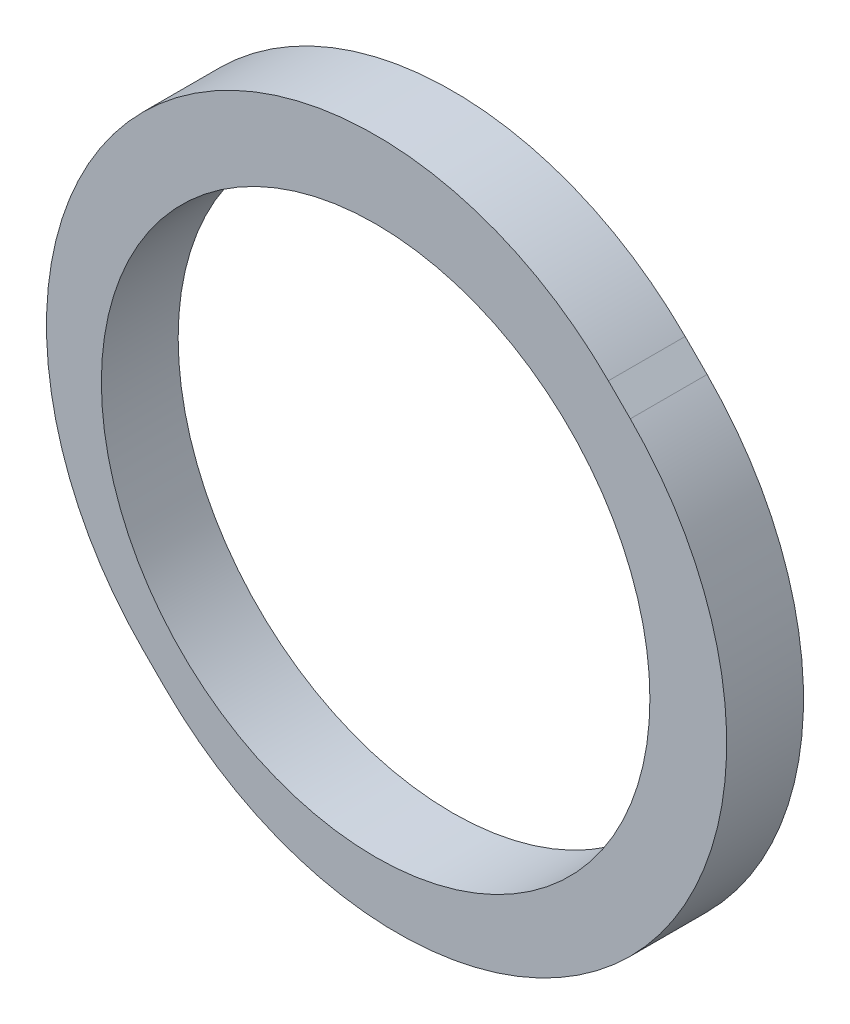
ISO-10303-21;
HEADER;
FILE_DESCRIPTION(('STEP AP214'),'2;1');
FILE_NAME('part.step','',(''),(''),'','','');
FILE_SCHEMA(('AUTOMOTIVE_DESIGN { 1 0 10303 214 1 1 1 1 }'));
ENDSEC;
DATA;
#1=APPLICATION_CONTEXT('core data for automotive mechanical design processes');
#2=APPLICATION_PROTOCOL_DEFINITION('international standard','automotive_design',2000,#1);
#3=PRODUCT_CONTEXT('',#1,'mechanical');
#4=PRODUCT('Part','Part','',(#3));
#5=PRODUCT_RELATED_PRODUCT_CATEGORY('part','',(#4));
#6=PRODUCT_DEFINITION_FORMATION('','',#4);
#7=PRODUCT_DEFINITION_CONTEXT('part definition',#1,'design');
#8=PRODUCT_DEFINITION('design','',#6,#7);
#9=PRODUCT_DEFINITION_SHAPE('','',#8);
#10=(LENGTH_UNIT() NAMED_UNIT(*) SI_UNIT(.MILLI.,.METRE.));
#11=(NAMED_UNIT(*) PLANE_ANGLE_UNIT() SI_UNIT($,.RADIAN.));
#12=(NAMED_UNIT(*) SI_UNIT($,.STERADIAN.) SOLID_ANGLE_UNIT());
#13=UNCERTAINTY_MEASURE_WITH_UNIT(LENGTH_MEASURE(1.E-05),#10,'distance_accuracy_value','');
#14=(GEOMETRIC_REPRESENTATION_CONTEXT(3) GLOBAL_UNCERTAINTY_ASSIGNED_CONTEXT((#13)) GLOBAL_UNIT_ASSIGNED_CONTEXT((#10,
#11,#12)) REPRESENTATION_CONTEXT('',''));
#15=CARTESIAN_POINT('',(0.,0.,0.));
#16=DIRECTION('',(0.,0.,1.));
#17=DIRECTION('',(1.,0.,0.));
#18=AXIS2_PLACEMENT_3D('',#15,#16,#17);
#19=CARTESIAN_POINT('',(98.07,-118.29,-0.045));
#20=DIRECTION('',(0.,0.,-1.));
#21=DIRECTION('',(0.,-1.,0.));
#22=AXIS2_PLACEMENT_3D('',#19,#20,#21);
#23=CYLINDRICAL_SURFACE('',#22,0.125);
#24=CARTESIAN_POINT('',(98.07,-118.29,1.6));
#25=DIRECTION('',(0.,0.,-1.));
#26=DIRECTION('',(0.,-1.,0.));
#27=AXIS2_PLACEMENT_3D('',#24,#25,#26);
#28=CIRCLE('',#27,0.125);
#29=CARTESIAN_POINT('',(98.07,-118.415,1.6));
#30=VERTEX_POINT('',#29);
#31=EDGE_CURVE('E112',#30,#30,#28,.T.);
#32=ORIENTED_EDGE('',*,*,#31,.T.);
#33=DIRECTION('',(0.,0.,1.));
#34=VECTOR('',#33,1.);
#35=CARTESIAN_POINT('',(98.07,-118.415,-0.045));
#36=LINE('',#35,#34);
#37=CARTESIAN_POINT('',(98.07,-118.415,1.635));
#38=VERTEX_POINT('',#37);
#39=EDGE_CURVE('E11',#30,#38,#36,.T.);
#40=ORIENTED_EDGE('',*,*,#39,.T.);
#41=CARTESIAN_POINT('',(98.07,-118.29,1.635));
#42=DIRECTION('',(0.,0.,-1.));
#43=DIRECTION('',(0.,-1.,0.));
#44=AXIS2_PLACEMENT_3D('',#41,#42,#43);
#45=CIRCLE('',#44,0.125);
#46=EDGE_CURVE('E26',#38,#38,#45,.T.);
#47=ORIENTED_EDGE('',*,*,#46,.F.);
#48=ORIENTED_EDGE('',*,*,#39,.F.);
#49=EDGE_LOOP('',(#32,#40,#47,#48));
#50=FACE_BOUND('',#49,.T.);
#51=ADVANCED_FACE('F17',(#50),#23,.F.);
#52=CARTESIAN_POINT('',(98.186066,-118.183933,1.6));
#53=DIRECTION('',(-0.707106781186548,-0.707106781186548,0.));
#54=DIRECTION('',(-0.707106781186548,0.707106781186548,0.));
#55=AXIS2_PLACEMENT_3D('',#52,#53,#54);
#56=PLANE('',#55);
#57=DIRECTION('',(-0.707106781186548,0.707106781186548,0.));
#58=VECTOR('',#57,1.);
#59=CARTESIAN_POINT('',(98.186066,-118.183933,1.6));
#60=LINE('',#59,#58);
#61=CARTESIAN_POINT('',(98.186066,-118.183933,1.6));
#62=VERTEX_POINT('',#61);
#63=CARTESIAN_POINT('',(98.176066,-118.173933,1.6));
#64=VERTEX_POINT('',#63);
#65=EDGE_CURVE('E116',#62,#64,#60,.T.);
#66=ORIENTED_EDGE('',*,*,#65,.T.);
#67=DIRECTION('',(0.,0.,1.));
#68=VECTOR('',#67,1.);
#69=CARTESIAN_POINT('',(98.176066,-118.173933,1.6));
#70=LINE('',#69,#68);
#71=CARTESIAN_POINT('',(98.176066,-118.173933,1.635));
#72=VERTEX_POINT('',#71);
#73=EDGE_CURVE('E84',#64,#72,#70,.T.);
#74=ORIENTED_EDGE('',*,*,#73,.T.);
#75=DIRECTION('',(-0.707106781186548,0.707106781186548,0.));
#76=VECTOR('',#75,1.);
#77=CARTESIAN_POINT('',(98.186066,-118.183933,1.635));
#78=LINE('',#77,#76);
#79=CARTESIAN_POINT('',(98.186066,-118.183933,1.635));
#80=VERTEX_POINT('',#79);
#81=EDGE_CURVE('E129',#80,#72,#78,.T.);
#82=ORIENTED_EDGE('',*,*,#81,.F.);
#83=DIRECTION('',(0.,0.,1.));
#84=VECTOR('',#83,1.);
#85=CARTESIAN_POINT('',(98.186066,-118.183933,1.6));
#86=LINE('',#85,#84);
#87=EDGE_CURVE('E126',#62,#80,#86,.T.);
#88=ORIENTED_EDGE('',*,*,#87,.F.);
#89=EDGE_LOOP('',(#66,#74,#82,#88));
#90=FACE_BOUND('',#89,.T.);
#91=ADVANCED_FACE('F19',(#90),#56,.F.);
#92=CARTESIAN_POINT('',(97.963933,-118.386066,1.635));
#93=DIRECTION('',(0.,0.,1.));
#94=DIRECTION('',(1.,0.,0.));
#95=AXIS2_PLACEMENT_3D('',#92,#93,#94);
#96=PLANE('',#95);
#97=ORIENTED_EDGE('',*,*,#46,.T.);
#98=EDGE_LOOP('',(#97));
#99=FACE_BOUND('',#98,.T.);
#100=DIRECTION('',(0.707106781186548,-0.707106781186548,0.));
#101=VECTOR('',#100,1.);
#102=CARTESIAN_POINT('',(97.963933,-118.386066,1.635));
#103=LINE('',#102,#101);
#104=CARTESIAN_POINT('',(97.963933,-118.386066,1.635));
#105=VERTEX_POINT('',#104);
#106=CARTESIAN_POINT('',(97.973933,-118.396066,1.635));
#107=VERTEX_POINT('',#106);
#108=EDGE_CURVE('E96',#105,#107,#103,.T.);
#109=ORIENTED_EDGE('',*,*,#108,.T.);
#110=CARTESIAN_POINT('',(98.0799995,-118.2899995,1.635));
#111=DIRECTION('',(0.,0.,1.));
#112=DIRECTION('',(-0.707106781186548,-0.707106781186548,0.));
#113=AXIS2_PLACEMENT_3D('',#110,#111,#112);
#114=CIRCLE('',#113,0.150000682813);
#115=EDGE_CURVE('E118',#107,#80,#114,.T.);
#116=ORIENTED_EDGE('',*,*,#115,.T.);
#117=ORIENTED_EDGE('',*,*,#81,.T.);
#118=CARTESIAN_POINT('',(98.0699995,-118.2799995,1.635));
#119=DIRECTION('',(0.,0.,1.));
#120=DIRECTION('',(0.707106781186548,0.707106781186548,0.));
#121=AXIS2_PLACEMENT_3D('',#118,#119,#120);
#122=CIRCLE('',#121,0.150000682813);
#123=EDGE_CURVE('E88',#72,#105,#122,.T.);
#124=ORIENTED_EDGE('',*,*,#123,.T.);
#125=EDGE_LOOP('',(#109,#116,#117,#124));
#126=FACE_BOUND('',#125,.T.);
#127=ADVANCED_FACE('F146',(#99,#126),#96,.T.);
#128=CARTESIAN_POINT('',(97.963933,-118.386066,1.6));
#129=DIRECTION('',(0.,0.,1.));
#130=DIRECTION('',(1.,0.,0.));
#131=AXIS2_PLACEMENT_3D('',#128,#129,#130);
#132=PLANE('',#131);
#133=ORIENTED_EDGE('',*,*,#31,.F.);
#134=EDGE_LOOP('',(#133));
#135=FACE_BOUND('',#134,.T.);
#136=CARTESIAN_POINT('',(98.0699995,-118.2799995,1.6));
#137=DIRECTION('',(0.,0.,1.));
#138=DIRECTION('',(0.707106781186548,0.707106781186548,0.));
#139=AXIS2_PLACEMENT_3D('',#136,#137,#138);
#140=CIRCLE('',#139,0.150000682813);
#141=CARTESIAN_POINT('',(97.963933,-118.386066,1.6));
#142=VERTEX_POINT('',#141);
#143=EDGE_CURVE('E77',#64,#142,#140,.T.);
#144=ORIENTED_EDGE('',*,*,#143,.F.);
#145=ORIENTED_EDGE('',*,*,#65,.F.);
#146=CARTESIAN_POINT('',(98.0799995,-118.2899995,1.6));
#147=DIRECTION('',(0.,0.,1.));
#148=DIRECTION('',(-0.707106781186548,-0.707106781186548,0.));
#149=AXIS2_PLACEMENT_3D('',#146,#147,#148);
#150=CIRCLE('',#149,0.150000682813);
#151=CARTESIAN_POINT('',(97.973933,-118.396066,1.6));
#152=VERTEX_POINT('',#151);
#153=EDGE_CURVE('E101',#152,#62,#150,.T.);
#154=ORIENTED_EDGE('',*,*,#153,.F.);
#155=DIRECTION('',(0.707106781186548,-0.707106781186548,0.));
#156=VECTOR('',#155,1.);
#157=CARTESIAN_POINT('',(97.963933,-118.386066,1.6));
#158=LINE('',#157,#156);
#159=EDGE_CURVE('E94',#142,#152,#158,.T.);
#160=ORIENTED_EDGE('',*,*,#159,.F.);
#161=EDGE_LOOP('',(#144,#145,#154,#160));
#162=FACE_BOUND('',#161,.T.);
#163=ADVANCED_FACE('F99',(#135,#162),#132,.F.);
#164=CARTESIAN_POINT('',(98.0799995,-118.2899995,1.6));
#165=DIRECTION('',(0.,0.,-1.));
#166=DIRECTION('',(-0.707106781186548,-0.707106781186548,0.));
#167=AXIS2_PLACEMENT_3D('',#164,#165,#166);
#168=CYLINDRICAL_SURFACE('',#167,0.150000682813);
#169=ORIENTED_EDGE('',*,*,#153,.T.);
#170=ORIENTED_EDGE('',*,*,#87,.T.);
#171=ORIENTED_EDGE('',*,*,#115,.F.);
#172=DIRECTION('',(0.,0.,1.));
#173=VECTOR('',#172,1.);
#174=CARTESIAN_POINT('',(97.973933,-118.396066,1.6));
#175=LINE('',#174,#173);
#176=EDGE_CURVE('E104',#152,#107,#175,.T.);
#177=ORIENTED_EDGE('',*,*,#176,.F.);
#178=EDGE_LOOP('',(#169,#170,#171,#177));
#179=FACE_BOUND('',#178,.T.);
#180=ADVANCED_FACE('F145',(#179),#168,.T.);
#181=CARTESIAN_POINT('',(98.0699995,-118.2799995,1.6));
#182=DIRECTION('',(0.,0.,-1.));
#183=DIRECTION('',(0.707106781186548,0.707106781186548,0.));
#184=AXIS2_PLACEMENT_3D('',#181,#182,#183);
#185=CYLINDRICAL_SURFACE('',#184,0.150000682813);
#186=ORIENTED_EDGE('',*,*,#143,.T.);
#187=DIRECTION('',(0.,0.,1.));
#188=VECTOR('',#187,1.);
#189=CARTESIAN_POINT('',(97.963933,-118.386066,1.6));
#190=LINE('',#189,#188);
#191=EDGE_CURVE('E81',#142,#105,#190,.T.);
#192=ORIENTED_EDGE('',*,*,#191,.T.);
#193=ORIENTED_EDGE('',*,*,#123,.F.);
#194=ORIENTED_EDGE('',*,*,#73,.F.);
#195=EDGE_LOOP('',(#186,#192,#193,#194));
#196=FACE_BOUND('',#195,.T.);
#197=ADVANCED_FACE('F79',(#196),#185,.T.);
#198=CARTESIAN_POINT('',(97.963933,-118.386066,1.6));
#199=DIRECTION('',(0.707106781186548,0.707106781186548,0.));
#200=DIRECTION('',(0.,0.,-1.));
#201=AXIS2_PLACEMENT_3D('',#198,#199,#200);
#202=PLANE('',#201);
#203=ORIENTED_EDGE('',*,*,#159,.T.);
#204=ORIENTED_EDGE('',*,*,#176,.T.);
#205=ORIENTED_EDGE('',*,*,#108,.F.);
#206=ORIENTED_EDGE('',*,*,#191,.F.);
#207=EDGE_LOOP('',(#203,#204,#205,#206));
#208=FACE_BOUND('',#207,.T.);
#209=ADVANCED_FACE('F92',(#208),#202,.F.);
#210=CLOSED_SHELL('',(#51,#91,#127,#163,#180,#197,#209));
#211=MANIFOLD_SOLID_BREP('B1',#210);
#212=ADVANCED_BREP_SHAPE_REPRESENTATION('',(#18,#211),#14);
#213=SHAPE_DEFINITION_REPRESENTATION(#9,#212);
ENDSEC;
END-ISO-10303-21;
